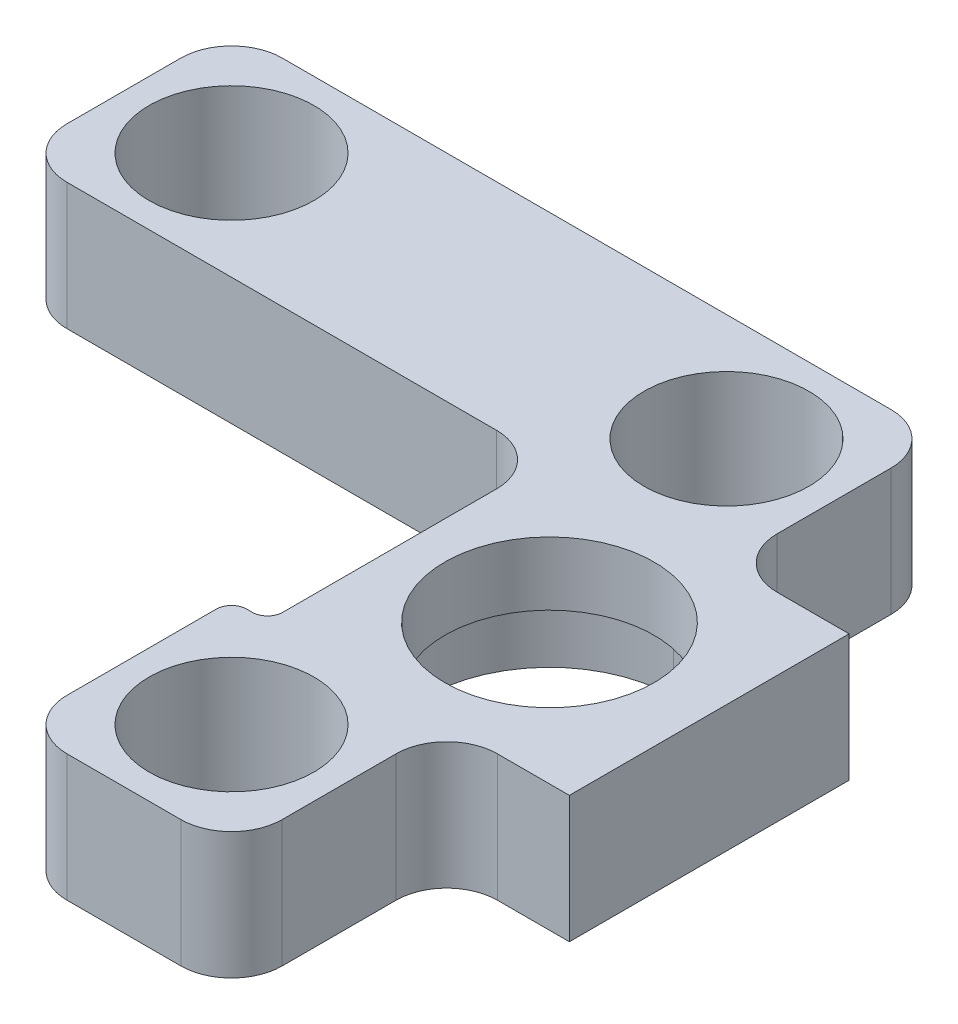
ISO-10303-21;
HEADER;
FILE_DESCRIPTION(('STEP AP214'),'2;1');
FILE_NAME('part.step','',(''),(''),'','','');
FILE_SCHEMA(('AUTOMOTIVE_DESIGN { 1 0 10303 214 1 1 1 1 }'));
ENDSEC;
DATA;
#1=APPLICATION_CONTEXT('core data for automotive mechanical design processes');
#2=APPLICATION_PROTOCOL_DEFINITION('international standard','automotive_design',2000,#1);
#3=PRODUCT_CONTEXT('',#1,'mechanical');
#4=PRODUCT('Part','Part','',(#3));
#5=PRODUCT_RELATED_PRODUCT_CATEGORY('part','',(#4));
#6=PRODUCT_DEFINITION_FORMATION('','',#4);
#7=PRODUCT_DEFINITION_CONTEXT('part definition',#1,'design');
#8=PRODUCT_DEFINITION('design','',#6,#7);
#9=PRODUCT_DEFINITION_SHAPE('','',#8);
#10=(LENGTH_UNIT() NAMED_UNIT(*) SI_UNIT(.MILLI.,.METRE.));
#11=(NAMED_UNIT(*) PLANE_ANGLE_UNIT() SI_UNIT($,.RADIAN.));
#12=(NAMED_UNIT(*) SI_UNIT($,.STERADIAN.) SOLID_ANGLE_UNIT());
#13=UNCERTAINTY_MEASURE_WITH_UNIT(LENGTH_MEASURE(1.E-05),#10,'distance_accuracy_value','');
#14=(GEOMETRIC_REPRESENTATION_CONTEXT(3) GLOBAL_UNCERTAINTY_ASSIGNED_CONTEXT((#13)) GLOBAL_UNIT_ASSIGNED_CONTEXT((#10,
#11,#12)) REPRESENTATION_CONTEXT('',''));
#15=CARTESIAN_POINT('',(0.,0.,0.));
#16=DIRECTION('',(0.,0.,1.));
#17=DIRECTION('',(1.,0.,0.));
#18=AXIS2_PLACEMENT_3D('',#15,#16,#17);
#19=CARTESIAN_POINT('',(-17.35,58.4903845939065,-12.8));
#20=DIRECTION('',(0.,0.,-1.));
#21=DIRECTION('',(0.,1.,0.));
#22=AXIS2_PLACEMENT_3D('',#19,#20,#21);
#23=PLANE('',#22);
#24=DIRECTION('',(-1.,0.,0.));
#25=VECTOR('',#24,1.);
#26=CARTESIAN_POINT('',(-17.35,58.4903845939065,-12.8));
#27=LINE('',#26,#25);
#28=CARTESIAN_POINT('',(8.65000000000003,58.4903845939065,-12.8));
#29=VERTEX_POINT('',#28);
#30=CARTESIAN_POINT('',(-15.35,58.4903845939065,-12.8));
#31=VERTEX_POINT('',#30);
#32=EDGE_CURVE('E288',#29,#31,#27,.T.);
#33=ORIENTED_EDGE('',*,*,#32,.T.);
#34=DIRECTION('',(0.,1.,0.));
#35=VECTOR('',#34,1.);
#36=CARTESIAN_POINT('',(-15.35,58.4903845939065,-12.8));
#37=LINE('',#36,#35);
#38=CARTESIAN_POINT('',(-15.35,63.4903845939065,-12.8));
#39=VERTEX_POINT('',#38);
#40=EDGE_CURVE('E361',#31,#39,#37,.T.);
#41=ORIENTED_EDGE('',*,*,#40,.T.);
#42=DIRECTION('',(1.,0.,0.));
#43=VECTOR('',#42,1.);
#44=CARTESIAN_POINT('',(0.,63.4903845939065,-12.8));
#45=LINE('',#44,#43);
#46=CARTESIAN_POINT('',(8.65000000000003,63.4903845939065,-12.8));
#47=VERTEX_POINT('',#46);
#48=EDGE_CURVE('E242',#39,#47,#45,.T.);
#49=ORIENTED_EDGE('',*,*,#48,.T.);
#50=DIRECTION('',(0.,1.,0.));
#51=VECTOR('',#50,1.);
#52=CARTESIAN_POINT('',(8.65000000000003,58.4903845939065,-12.8));
#53=LINE('',#52,#51);
#54=EDGE_CURVE('E359',#47,#29,#53,.F.);
#55=ORIENTED_EDGE('',*,*,#54,.T.);
#56=EDGE_LOOP('',(#33,#41,#49,#55));
#57=FACE_BOUND('',#56,.T.);
#58=ADVANCED_FACE('F35',(#57),#23,.T.);
#59=CARTESIAN_POINT('',(10.65,58.4903845939065,-12.8));
#60=DIRECTION('',(1.,0.,0.));
#61=DIRECTION('',(0.,0.,-1.));
#62=AXIS2_PLACEMENT_3D('',#59,#60,#61);
#63=PLANE('',#62);
#64=DIRECTION('',(0.,0.,-1.));
#65=VECTOR('',#64,1.);
#66=CARTESIAN_POINT('',(10.65,58.4903845939065,-12.8));
#67=LINE('',#66,#65);
#68=CARTESIAN_POINT('',(10.65,58.4903845939065,-6.3147186257614));
#69=VERTEX_POINT('',#68);
#70=CARTESIAN_POINT('',(10.65,58.4903845939065,-10.8));
#71=VERTEX_POINT('',#70);
#72=EDGE_CURVE('E221',#69,#71,#67,.T.);
#73=ORIENTED_EDGE('',*,*,#72,.T.);
#74=DIRECTION('',(0.,1.,0.));
#75=VECTOR('',#74,1.);
#76=CARTESIAN_POINT('',(10.65,58.4903845939065,-10.8));
#77=LINE('',#76,#75);
#78=CARTESIAN_POINT('',(10.65,63.4903845939065,-10.8));
#79=VERTEX_POINT('',#78);
#80=EDGE_CURVE('E390',#71,#79,#77,.T.);
#81=ORIENTED_EDGE('',*,*,#80,.T.);
#82=DIRECTION('',(0.,0.,1.));
#83=VECTOR('',#82,1.);
#84=CARTESIAN_POINT('',(10.65,63.4903845939065,0.));
#85=LINE('',#84,#83);
#86=CARTESIAN_POINT('',(10.65,63.4903845939065,-6.3147186257614));
#87=VERTEX_POINT('',#86);
#88=EDGE_CURVE('E236',#79,#87,#85,.T.);
#89=ORIENTED_EDGE('',*,*,#88,.T.);
#90=DIRECTION('',(0.,1.,0.));
#91=VECTOR('',#90,1.);
#92=CARTESIAN_POINT('',(10.65,58.4903845939065,-6.3147186257614));
#93=LINE('',#92,#91);
#94=EDGE_CURVE('E388',#87,#69,#93,.F.);
#95=ORIENTED_EDGE('',*,*,#94,.T.);
#96=EDGE_LOOP('',(#73,#81,#89,#95));
#97=FACE_BOUND('',#96,.T.);
#98=ADVANCED_FACE('F430',(#97),#63,.T.);
#99=CARTESIAN_POINT('',(10.65,58.4903845939065,-4.3147186257614));
#100=DIRECTION('',(0.,0.,-1.));
#101=DIRECTION('',(0.,1.,0.));
#102=AXIS2_PLACEMENT_3D('',#99,#100,#101);
#103=PLANE('',#102);
#104=DIRECTION('',(-1.,0.,0.));
#105=VECTOR('',#104,1.);
#106=CARTESIAN_POINT('',(10.65,58.4903845939065,-4.3147186257614));
#107=LINE('',#106,#105);
#108=CARTESIAN_POINT('',(15.48528137,58.4903845939065,-4.3147186257614));
#109=VERTEX_POINT('',#108);
#110=CARTESIAN_POINT('',(12.65,58.4903845939065,-4.3147186257614));
#111=VERTEX_POINT('',#110);
#112=EDGE_CURVE('E321',#109,#111,#107,.T.);
#113=ORIENTED_EDGE('',*,*,#112,.T.);
#114=DIRECTION('',(0.,1.,0.));
#115=VECTOR('',#114,1.);
#116=CARTESIAN_POINT('',(12.65,63.4903845939065,-4.3147186257614));
#117=LINE('',#116,#115);
#118=CARTESIAN_POINT('',(12.65,63.4903845939065,-4.3147186257614));
#119=VERTEX_POINT('',#118);
#120=EDGE_CURVE('E393',#111,#119,#117,.T.);
#121=ORIENTED_EDGE('',*,*,#120,.T.);
#122=DIRECTION('',(1.,0.,0.));
#123=VECTOR('',#122,1.);
#124=CARTESIAN_POINT('',(0.,63.4903845939065,-4.3147186257614));
#125=LINE('',#124,#123);
#126=CARTESIAN_POINT('',(15.48528137,63.4903845939065,-4.3147186257614));
#127=VERTEX_POINT('',#126);
#128=EDGE_CURVE('E234',#119,#127,#125,.T.);
#129=ORIENTED_EDGE('',*,*,#128,.T.);
#130=DIRECTION('',(0.,1.,0.));
#131=VECTOR('',#130,1.);
#132=CARTESIAN_POINT('',(15.48528137,58.4903845939065,-4.3147186257614));
#133=LINE('',#132,#131);
#134=EDGE_CURVE('E220',#109,#127,#133,.T.);
#135=ORIENTED_EDGE('',*,*,#134,.F.);
#136=EDGE_LOOP('',(#113,#121,#129,#135));
#137=FACE_BOUND('',#136,.T.);
#138=ADVANCED_FACE('F426',(#137),#103,.T.);
#139=CARTESIAN_POINT('',(15.48528137,58.4903845939065,-4.3147186257614));
#140=DIRECTION('',(1.,0.,0.));
#141=DIRECTION('',(0.,1.,0.));
#142=AXIS2_PLACEMENT_3D('',#139,#140,#141);
#143=PLANE('',#142);
#144=ORIENTED_EDGE('',*,*,#134,.T.);
#145=DIRECTION('',(0.,0.,1.));
#146=VECTOR('',#145,1.);
#147=CARTESIAN_POINT('',(15.48528137,63.4903845939065,0.));
#148=LINE('',#147,#146);
#149=CARTESIAN_POINT('',(15.48528137,63.4903845939065,6.71471862576139));
#150=VERTEX_POINT('',#149);
#151=EDGE_CURVE('E228',#127,#150,#148,.T.);
#152=ORIENTED_EDGE('',*,*,#151,.T.);
#153=DIRECTION('',(0.,1.,0.));
#154=VECTOR('',#153,1.);
#155=CARTESIAN_POINT('',(15.48528137,58.4903845939065,6.71471862576139));
#156=LINE('',#155,#154);
#157=CARTESIAN_POINT('',(15.48528137,58.4903845939065,6.71471862576139));
#158=VERTEX_POINT('',#157);
#159=EDGE_CURVE('E209',#158,#150,#156,.T.);
#160=ORIENTED_EDGE('',*,*,#159,.F.);
#161=DIRECTION('',(0.,0.,-1.));
#162=VECTOR('',#161,1.);
#163=CARTESIAN_POINT('',(15.48528137,58.4903845939065,-4.3147186257614));
#164=LINE('',#163,#162);
#165=EDGE_CURVE('E319',#158,#109,#164,.T.);
#166=ORIENTED_EDGE('',*,*,#165,.T.);
#167=EDGE_LOOP('',(#144,#152,#160,#166));
#168=FACE_BOUND('',#167,.T.);
#169=ADVANCED_FACE('F233',(#168),#143,.T.);
#170=CARTESIAN_POINT('',(15.48528137,58.4903845939065,6.71471862576139));
#171=DIRECTION('',(0.,0.,1.));
#172=DIRECTION('',(1.,0.,0.));
#173=AXIS2_PLACEMENT_3D('',#170,#171,#172);
#174=PLANE('',#173);
#175=DIRECTION('',(-1.,0.,0.));
#176=VECTOR('',#175,1.);
#177=CARTESIAN_POINT('',(0.,63.4903845939065,6.7147186257614));
#178=LINE('',#177,#176);
#179=CARTESIAN_POINT('',(12.65,63.4903845939065,6.71471862576139));
#180=VERTEX_POINT('',#179);
#181=EDGE_CURVE('E212',#150,#180,#178,.T.);
#182=ORIENTED_EDGE('',*,*,#181,.T.);
#183=DIRECTION('',(0.,1.,0.));
#184=VECTOR('',#183,1.);
#185=CARTESIAN_POINT('',(12.65,58.4903845939065,6.71471862576139));
#186=LINE('',#185,#184);
#187=CARTESIAN_POINT('',(12.65,58.4903845939065,6.71471862576139));
#188=VERTEX_POINT('',#187);
#189=EDGE_CURVE('E401',#180,#188,#186,.F.);
#190=ORIENTED_EDGE('',*,*,#189,.T.);
#191=DIRECTION('',(1.,0.,0.));
#192=VECTOR('',#191,1.);
#193=CARTESIAN_POINT('',(15.48528137,58.4903845939065,6.71471862576139));
#194=LINE('',#193,#192);
#195=EDGE_CURVE('E215',#188,#158,#194,.T.);
#196=ORIENTED_EDGE('',*,*,#195,.T.);
#197=ORIENTED_EDGE('',*,*,#159,.T.);
#198=EDGE_LOOP('',(#182,#190,#196,#197));
#199=FACE_BOUND('',#198,.T.);
#200=ADVANCED_FACE('F211',(#199),#174,.T.);
#201=CARTESIAN_POINT('',(10.65,58.4903845939065,6.71471862576139));
#202=DIRECTION('',(1.,0.,0.));
#203=DIRECTION('',(0.,0.,-1.));
#204=AXIS2_PLACEMENT_3D('',#201,#202,#203);
#205=PLANE('',#204);
#206=DIRECTION('',(0.,0.,-1.));
#207=VECTOR('',#206,1.);
#208=CARTESIAN_POINT('',(10.65,58.4903845939065,6.71471862576139));
#209=LINE('',#208,#207);
#210=CARTESIAN_POINT('',(10.65,58.4903845939065,13.2));
#211=VERTEX_POINT('',#210);
#212=CARTESIAN_POINT('',(10.65,58.4903845939065,8.71471862576139));
#213=VERTEX_POINT('',#212);
#214=EDGE_CURVE('E315',#211,#213,#209,.T.);
#215=ORIENTED_EDGE('',*,*,#214,.T.);
#216=DIRECTION('',(0.,1.,0.));
#217=VECTOR('',#216,1.);
#218=CARTESIAN_POINT('',(10.65,63.4903845939065,8.71471862576139));
#219=LINE('',#218,#217);
#220=CARTESIAN_POINT('',(10.65,63.4903845939065,8.71471862576139));
#221=VERTEX_POINT('',#220);
#222=EDGE_CURVE('E398',#213,#221,#219,.T.);
#223=ORIENTED_EDGE('',*,*,#222,.T.);
#224=DIRECTION('',(0.,0.,1.));
#225=VECTOR('',#224,1.);
#226=CARTESIAN_POINT('',(10.65,63.4903845939065,0.));
#227=LINE('',#226,#225);
#228=CARTESIAN_POINT('',(10.65,63.4903845939065,13.2));
#229=VERTEX_POINT('',#228);
#230=EDGE_CURVE('E230',#221,#229,#227,.T.);
#231=ORIENTED_EDGE('',*,*,#230,.T.);
#232=DIRECTION('',(0.,1.,0.));
#233=VECTOR('',#232,1.);
#234=CARTESIAN_POINT('',(10.65,58.4903845939065,13.2));
#235=LINE('',#234,#233);
#236=EDGE_CURVE('E396',#229,#211,#235,.F.);
#237=ORIENTED_EDGE('',*,*,#236,.T.);
#238=EDGE_LOOP('',(#215,#223,#231,#237));
#239=FACE_BOUND('',#238,.T.);
#240=ADVANCED_FACE('F483',(#239),#205,.T.);
#241=CARTESIAN_POINT('',(10.65,58.4903845939065,15.2));
#242=DIRECTION('',(0.,0.,1.));
#243=DIRECTION('',(0.,-1.,0.));
#244=AXIS2_PLACEMENT_3D('',#241,#242,#243);
#245=PLANE('',#244);
#246=DIRECTION('',(1.,0.,0.));
#247=VECTOR('',#246,1.);
#248=CARTESIAN_POINT('',(10.65,58.4903845939065,15.2));
#249=LINE('',#248,#247);
#250=CARTESIAN_POINT('',(4.16471862576142,58.4903845939065,15.2));
#251=VERTEX_POINT('',#250);
#252=CARTESIAN_POINT('',(8.65000000000003,58.4903845939065,15.2));
#253=VERTEX_POINT('',#252);
#254=EDGE_CURVE('E313',#251,#253,#249,.T.);
#255=ORIENTED_EDGE('',*,*,#254,.T.);
#256=DIRECTION('',(0.,1.,0.));
#257=VECTOR('',#256,1.);
#258=CARTESIAN_POINT('',(8.65000000000003,58.4903845939065,15.2));
#259=LINE('',#258,#257);
#260=CARTESIAN_POINT('',(8.65000000000003,63.4903845939065,15.2));
#261=VERTEX_POINT('',#260);
#262=EDGE_CURVE('E404',#253,#261,#259,.T.);
#263=ORIENTED_EDGE('',*,*,#262,.T.);
#264=DIRECTION('',(-1.,0.,0.));
#265=VECTOR('',#264,1.);
#266=CARTESIAN_POINT('',(0.,63.4903845939065,15.2));
#267=LINE('',#266,#265);
#268=CARTESIAN_POINT('',(4.16471862576142,63.4903845939065,15.2));
#269=VERTEX_POINT('',#268);
#270=EDGE_CURVE('E479',#261,#269,#267,.T.);
#271=ORIENTED_EDGE('',*,*,#270,.T.);
#272=DIRECTION('',(0.,1.,0.));
#273=VECTOR('',#272,1.);
#274=CARTESIAN_POINT('',(4.16471862576142,58.4903845939065,15.2));
#275=LINE('',#274,#273);
#276=EDGE_CURVE('E57',#269,#251,#275,.F.);
#277=ORIENTED_EDGE('',*,*,#276,.T.);
#278=EDGE_LOOP('',(#255,#263,#271,#277));
#279=FACE_BOUND('',#278,.T.);
#280=ADVANCED_FACE('F489',(#279),#245,.T.);
#281=CARTESIAN_POINT('',(2.16471862576142,58.4903845939065,15.2));
#282=DIRECTION('',(-1.,0.,0.));
#283=DIRECTION('',(0.,0.,1.));
#284=AXIS2_PLACEMENT_3D('',#281,#282,#283);
#285=PLANE('',#284);
#286=DIRECTION('',(0.,0.,1.));
#287=VECTOR('',#286,1.);
#288=CARTESIAN_POINT('',(2.16471862576142,58.4903845939065,15.2));
#289=LINE('',#288,#287);
#290=CARTESIAN_POINT('',(2.16471862576142,58.4903845939065,7.31471862576143));
#291=VERTEX_POINT('',#290);
#292=CARTESIAN_POINT('',(2.16471862576142,58.4903845939065,13.2));
#293=VERTEX_POINT('',#292);
#294=EDGE_CURVE('E310',#291,#293,#289,.T.);
#295=ORIENTED_EDGE('',*,*,#294,.T.);
#296=DIRECTION('',(0.,1.,0.));
#297=VECTOR('',#296,1.);
#298=CARTESIAN_POINT('',(2.16471862576142,58.4903845939065,13.2));
#299=LINE('',#298,#297);
#300=CARTESIAN_POINT('',(2.16471862576142,63.4903845939065,13.2));
#301=VERTEX_POINT('',#300);
#302=EDGE_CURVE('E407',#293,#301,#299,.T.);
#303=ORIENTED_EDGE('',*,*,#302,.T.);
#304=DIRECTION('',(0.,0.,-1.));
#305=VECTOR('',#304,1.);
#306=CARTESIAN_POINT('',(2.16471862576142,63.4903845939065,0.));
#307=LINE('',#306,#305);
#308=CARTESIAN_POINT('',(2.16471862576142,63.4903845939065,7.31471862576143));
#309=VERTEX_POINT('',#308);
#310=EDGE_CURVE('E471',#301,#309,#307,.T.);
#311=ORIENTED_EDGE('',*,*,#310,.T.);
#312=DIRECTION('',(0.,1.,0.));
#313=VECTOR('',#312,1.);
#314=CARTESIAN_POINT('',(2.16471862576142,58.4903845939065,7.31471862576143));
#315=LINE('',#314,#313);
#316=EDGE_CURVE('E340',#309,#291,#315,.F.);
#317=ORIENTED_EDGE('',*,*,#316,.T.);
#318=EDGE_LOOP('',(#295,#303,#311,#317));
#319=FACE_BOUND('',#318,.T.);
#320=ADVANCED_FACE('F495',(#319),#285,.T.);
#321=CARTESIAN_POINT('',(2.16471862576142,58.4903845939065,6.71471862576143));
#322=DIRECTION('',(0.,0.,-1.));
#323=DIRECTION('',(0.,1.,0.));
#324=AXIS2_PLACEMENT_3D('',#321,#322,#323);
#325=PLANE('',#324);
#326=DIRECTION('',(-1.,0.,0.));
#327=VECTOR('',#326,1.);
#328=CARTESIAN_POINT('',(2.16471862576142,58.4903845939065,6.71471862576143));
#329=LINE('',#328,#327);
#330=CARTESIAN_POINT('',(2.98528137,58.4903845939065,6.71471862576143));
#331=VERTEX_POINT('',#330);
#332=CARTESIAN_POINT('',(2.76471862576142,58.4903845939065,6.71471862576143));
#333=VERTEX_POINT('',#332);
#334=EDGE_CURVE('E307',#331,#333,#329,.T.);
#335=ORIENTED_EDGE('',*,*,#334,.T.);
#336=DIRECTION('',(0.,1.,0.));
#337=VECTOR('',#336,1.);
#338=CARTESIAN_POINT('',(2.76471862576142,58.4903845939065,6.71471862576143));
#339=LINE('',#338,#337);
#340=CARTESIAN_POINT('',(2.76471862576142,63.4903845939065,6.71471862576143));
#341=VERTEX_POINT('',#340);
#342=EDGE_CURVE('E334',#333,#341,#339,.T.);
#343=ORIENTED_EDGE('',*,*,#342,.T.);
#344=DIRECTION('',(1.,0.,0.));
#345=VECTOR('',#344,1.);
#346=CARTESIAN_POINT('',(0.,63.4903845939065,6.71471862576143));
#347=LINE('',#346,#345);
#348=CARTESIAN_POINT('',(2.98528137,63.4903845939065,6.71471862576143));
#349=VERTEX_POINT('',#348);
#350=EDGE_CURVE('E467',#341,#349,#347,.T.);
#351=ORIENTED_EDGE('',*,*,#350,.T.);
#352=DIRECTION('',(0.,1.,0.));
#353=VECTOR('',#352,1.);
#354=CARTESIAN_POINT('',(2.98528137,58.4903845939065,6.71471862576143));
#355=LINE('',#354,#353);
#356=EDGE_CURVE('E326',#349,#331,#355,.F.);
#357=ORIENTED_EDGE('',*,*,#356,.T.);
#358=EDGE_LOOP('',(#335,#343,#351,#357));
#359=FACE_BOUND('',#358,.T.);
#360=ADVANCED_FACE('F505',(#359),#325,.T.);
#361=CARTESIAN_POINT('',(3.58528137,58.4903845939065,6.71471862576143));
#362=DIRECTION('',(-1.,0.,0.));
#363=DIRECTION('',(0.,-1.,0.));
#364=AXIS2_PLACEMENT_3D('',#361,#362,#363);
#365=PLANE('',#364);
#366=DIRECTION('',(0.,0.,-1.));
#367=VECTOR('',#366,1.);
#368=CARTESIAN_POINT('',(3.58528137,63.4903845939065,0.));
#369=LINE('',#368,#367);
#370=CARTESIAN_POINT('',(3.58528137,63.4903845939065,6.11471862576143));
#371=VERTEX_POINT('',#370);
#372=CARTESIAN_POINT('',(3.58528137,63.4903845939065,-2.31471862576144));
#373=VERTEX_POINT('',#372);
#374=EDGE_CURVE('E462',#371,#373,#369,.T.);
#375=ORIENTED_EDGE('',*,*,#374,.T.);
#376=DIRECTION('',(0.,1.,0.));
#377=VECTOR('',#376,1.);
#378=CARTESIAN_POINT('',(3.58528137,58.4903845939065,-2.31471862576144));
#379=LINE('',#378,#377);
#380=CARTESIAN_POINT('',(3.58528137,58.4903845939065,-2.31471862576144));
#381=VERTEX_POINT('',#380);
#382=EDGE_CURVE('E357',#373,#381,#379,.F.);
#383=ORIENTED_EDGE('',*,*,#382,.T.);
#384=DIRECTION('',(0.,0.,1.));
#385=VECTOR('',#384,1.);
#386=CARTESIAN_POINT('',(3.58528137,58.4903845939065,6.71471862576143));
#387=LINE('',#386,#385);
#388=CARTESIAN_POINT('',(3.58528137,58.4903845939065,6.11471862576143));
#389=VERTEX_POINT('',#388);
#390=EDGE_CURVE('E305',#381,#389,#387,.T.);
#391=ORIENTED_EDGE('',*,*,#390,.T.);
#392=DIRECTION('',(0.,1.,0.));
#393=VECTOR('',#392,1.);
#394=CARTESIAN_POINT('',(3.58528137,63.4903845939065,6.11471862576143));
#395=LINE('',#394,#393);
#396=EDGE_CURVE('E344',#389,#371,#395,.T.);
#397=ORIENTED_EDGE('',*,*,#396,.T.);
#398=EDGE_LOOP('',(#375,#383,#391,#397));
#399=FACE_BOUND('',#398,.T.);
#400=ADVANCED_FACE('F464',(#399),#365,.T.);
#401=CARTESIAN_POINT('',(3.58528137,58.4903845939065,-4.31471862576144));
#402=DIRECTION('',(0.,0.,1.));
#403=DIRECTION('',(1.,0.,0.));
#404=AXIS2_PLACEMENT_3D('',#401,#402,#403);
#405=PLANE('',#404);
#406=DIRECTION('',(1.,0.,0.));
#407=VECTOR('',#406,1.);
#408=CARTESIAN_POINT('',(3.58528137,58.4903845939065,-4.31471862576144));
#409=LINE('',#408,#407);
#410=CARTESIAN_POINT('',(-15.35,58.4903845939065,-4.3147186257614));
#411=VERTEX_POINT('',#410);
#412=CARTESIAN_POINT('',(1.58528137,58.4903845939065,-4.31471862576144));
#413=VERTEX_POINT('',#412);
#414=EDGE_CURVE('E302',#411,#413,#409,.T.);
#415=ORIENTED_EDGE('',*,*,#414,.T.);
#416=DIRECTION('',(0.,1.,0.));
#417=VECTOR('',#416,1.);
#418=CARTESIAN_POINT('',(1.58528137,63.4903845939065,-4.31471862576144));
#419=LINE('',#418,#417);
#420=CARTESIAN_POINT('',(1.58528137,63.4903845939065,-4.31471862576144));
#421=VERTEX_POINT('',#420);
#422=EDGE_CURVE('E354',#413,#421,#419,.T.);
#423=ORIENTED_EDGE('',*,*,#422,.T.);
#424=DIRECTION('',(-1.,0.,0.));
#425=VECTOR('',#424,1.);
#426=CARTESIAN_POINT('',(0.,63.4903845939065,-4.31471862576144));
#427=LINE('',#426,#425);
#428=CARTESIAN_POINT('',(-15.35,63.4903845939065,-4.3147186257614));
#429=VERTEX_POINT('',#428);
#430=EDGE_CURVE('E248',#421,#429,#427,.T.);
#431=ORIENTED_EDGE('',*,*,#430,.T.);
#432=DIRECTION('',(0.,1.,0.));
#433=VECTOR('',#432,1.);
#434=CARTESIAN_POINT('',(-15.35,58.4903845939065,-4.3147186257614));
#435=LINE('',#434,#433);
#436=EDGE_CURVE('E352',#429,#411,#435,.F.);
#437=ORIENTED_EDGE('',*,*,#436,.T.);
#438=EDGE_LOOP('',(#415,#423,#431,#437));
#439=FACE_BOUND('',#438,.T.);
#440=ADVANCED_FACE('F453',(#439),#405,.T.);
#441=CARTESIAN_POINT('',(-17.35,58.4903845939065,-4.3147186257614));
#442=DIRECTION('',(-1.,0.,0.));
#443=DIRECTION('',(0.,0.,1.));
#444=AXIS2_PLACEMENT_3D('',#441,#442,#443);
#445=PLANE('',#444);
#446=DIRECTION('',(0.,0.,-1.));
#447=VECTOR('',#446,1.);
#448=CARTESIAN_POINT('',(-17.35,63.4903845939065,0.));
#449=LINE('',#448,#447);
#450=CARTESIAN_POINT('',(-17.35,63.4903845939065,-6.3147186257614));
#451=VERTEX_POINT('',#450);
#452=CARTESIAN_POINT('',(-17.35,63.4903845939065,-10.8));
#453=VERTEX_POINT('',#452);
#454=EDGE_CURVE('E245',#451,#453,#449,.T.);
#455=ORIENTED_EDGE('',*,*,#454,.T.);
#456=DIRECTION('',(0.,1.,0.));
#457=VECTOR('',#456,1.);
#458=CARTESIAN_POINT('',(-17.35,58.4903845939065,-10.8));
#459=LINE('',#458,#457);
#460=CARTESIAN_POINT('',(-17.35,58.4903845939065,-10.8));
#461=VERTEX_POINT('',#460);
#462=EDGE_CURVE('E377',#453,#461,#459,.F.);
#463=ORIENTED_EDGE('',*,*,#462,.T.);
#464=DIRECTION('',(0.,0.,1.));
#465=VECTOR('',#464,1.);
#466=CARTESIAN_POINT('',(-17.35,58.4903845939065,-4.3147186257614));
#467=LINE('',#466,#465);
#468=CARTESIAN_POINT('',(-17.35,58.4903845939065,-6.3147186257614));
#469=VERTEX_POINT('',#468);
#470=EDGE_CURVE('E299',#461,#469,#467,.T.);
#471=ORIENTED_EDGE('',*,*,#470,.T.);
#472=DIRECTION('',(0.,1.,0.));
#473=VECTOR('',#472,1.);
#474=CARTESIAN_POINT('',(-17.35,58.4903845939065,-6.3147186257614));
#475=LINE('',#474,#473);
#476=EDGE_CURVE('E374',#469,#451,#475,.T.);
#477=ORIENTED_EDGE('',*,*,#476,.T.);
#478=EDGE_LOOP('',(#455,#463,#471,#477));
#479=FACE_BOUND('',#478,.T.);
#480=ADVANCED_FACE('F445',(#479),#445,.T.);
#481=CARTESIAN_POINT('',(0.,58.4903845939065,0.));
#482=DIRECTION('',(0.,-1.,0.));
#483=DIRECTION('',(0.,0.,-1.));
#484=AXIS2_PLACEMENT_3D('',#481,#482,#483);
#485=PLANE('',#484);
#486=CARTESIAN_POINT('',(6.40735931288072,58.4903845939065,10.9573593128807));
#487=DIRECTION('',(0.,1.,0.));
#488=DIRECTION('',(0.,0.,1.));
#489=AXIS2_PLACEMENT_3D('',#486,#487,#488);
#490=CIRCLE('',#489,3.25);
#491=CARTESIAN_POINT('',(6.40735931288072,58.4903845939065,14.2073593128807));
#492=VERTEX_POINT('',#491);
#493=EDGE_CURVE('E251',#492,#492,#490,.T.);
#494=ORIENTED_EDGE('',*,*,#493,.T.);
#495=EDGE_LOOP('',(#494));
#496=FACE_BOUND('',#495,.T.);
#497=CARTESIAN_POINT('',(6.40735931288076,58.4903845939065,-8.55735931288068));
#498=DIRECTION('',(0.,1.,0.));
#499=DIRECTION('',(0.,0.,1.));
#500=AXIS2_PLACEMENT_3D('',#497,#498,#499);
#501=CIRCLE('',#500,3.24999999999997);
#502=CARTESIAN_POINT('',(6.40735931288076,58.4903845939065,-5.30735931288071));
#503=VERTEX_POINT('',#502);
#504=EDGE_CURVE('E254',#503,#503,#501,.T.);
#505=ORIENTED_EDGE('',*,*,#504,.T.);
#506=EDGE_LOOP('',(#505));
#507=FACE_BOUND('',#506,.T.);
#508=CARTESIAN_POINT('',(-13.1073593128807,58.4903845939065,-8.55735931288072));
#509=DIRECTION('',(0.,1.,0.));
#510=DIRECTION('',(0.,0.,1.));
#511=AXIS2_PLACEMENT_3D('',#508,#509,#510);
#512=CIRCLE('',#511,3.25);
#513=CARTESIAN_POINT('',(-13.1073593128807,58.4903845939065,-5.30735931288072));
#514=VERTEX_POINT('',#513);
#515=EDGE_CURVE('E257',#514,#514,#512,.T.);
#516=ORIENTED_EDGE('',*,*,#515,.T.);
#517=EDGE_LOOP('',(#516));
#518=FACE_BOUND('',#517,.T.);
#519=CARTESIAN_POINT('',(9.18528137,58.4903845939065,1.2));
#520=DIRECTION('',(0.,1.,0.));
#521=DIRECTION('',(0.,0.,1.));
#522=AXIS2_PLACEMENT_3D('',#519,#520,#521);
#523=CIRCLE('',#522,4.89999999999986);
#524=CARTESIAN_POINT('',(9.18528137,58.4903845939065,-3.69999999999989));
#525=VERTEX_POINT('',#524);
#526=CARTESIAN_POINT('',(9.18528137,58.4903845939065,6.09999999999984));
#527=VERTEX_POINT('',#526);
#528=EDGE_CURVE('E261',#525,#527,#523,.T.);
#529=ORIENTED_EDGE('',*,*,#528,.T.);
#530=DIRECTION('',(1.,0.,0.));
#531=VECTOR('',#530,1.);
#532=CARTESIAN_POINT('',(14.78528137,58.4903845939065,6.1));
#533=LINE('',#532,#531);
#534=CARTESIAN_POINT('',(14.78528137,58.4903845939065,6.1));
#535=VERTEX_POINT('',#534);
#536=EDGE_CURVE('E264',#527,#535,#533,.T.);
#537=ORIENTED_EDGE('',*,*,#536,.T.);
#538=DIRECTION('',(0.,0.,-1.));
#539=VECTOR('',#538,1.);
#540=CARTESIAN_POINT('',(14.78528137,58.4903845939065,-3.70000000000001));
#541=LINE('',#540,#539);
#542=CARTESIAN_POINT('',(14.78528137,58.4903845939065,-3.70000000000001));
#543=VERTEX_POINT('',#542);
#544=EDGE_CURVE('E268',#535,#543,#541,.T.);
#545=ORIENTED_EDGE('',*,*,#544,.T.);
#546=DIRECTION('',(-1.,0.,0.));
#547=VECTOR('',#546,1.);
#548=CARTESIAN_POINT('',(14.78528137,58.4903845939065,-3.70000000000001));
#549=LINE('',#548,#547);
#550=EDGE_CURVE('E271',#543,#525,#549,.T.);
#551=ORIENTED_EDGE('',*,*,#550,.T.);
#552=EDGE_LOOP('',(#529,#537,#545,#551));
#553=FACE_BOUND('',#552,.T.);
#554=ORIENTED_EDGE('',*,*,#470,.F.);
#555=CARTESIAN_POINT('',(-15.35,58.4903845939065,-10.8));
#556=DIRECTION('',(0.,-1.,0.));
#557=DIRECTION('',(0.,0.,-1.));
#558=AXIS2_PLACEMENT_3D('',#555,#556,#557);
#559=CIRCLE('',#558,2.);
#560=EDGE_CURVE('E386',#461,#31,#559,.T.);
#561=ORIENTED_EDGE('',*,*,#560,.T.);
#562=ORIENTED_EDGE('',*,*,#32,.F.);
#563=CARTESIAN_POINT('',(8.65000000000003,58.4903845939065,-10.8));
#564=DIRECTION('',(0.,-1.,0.));
#565=DIRECTION('',(0.,0.,-1.));
#566=AXIS2_PLACEMENT_3D('',#563,#564,#565);
#567=CIRCLE('',#566,2.);
#568=EDGE_CURVE('E382',#29,#71,#567,.T.);
#569=ORIENTED_EDGE('',*,*,#568,.T.);
#570=ORIENTED_EDGE('',*,*,#72,.F.);
#571=CARTESIAN_POINT('',(12.65,58.4903845939065,-6.3147186257614));
#572=DIRECTION('',(0.,-1.,0.));
#573=DIRECTION('',(0.,0.,-1.));
#574=AXIS2_PLACEMENT_3D('',#571,#572,#573);
#575=CIRCLE('',#574,2.);
#576=EDGE_CURVE('E416',#69,#111,#575,.F.);
#577=ORIENTED_EDGE('',*,*,#576,.T.);
#578=ORIENTED_EDGE('',*,*,#112,.F.);
#579=ORIENTED_EDGE('',*,*,#165,.F.);
#580=ORIENTED_EDGE('',*,*,#195,.F.);
#581=CARTESIAN_POINT('',(12.65,58.4903845939065,8.71471862576139));
#582=DIRECTION('',(0.,-1.,0.));
#583=DIRECTION('',(0.,0.,-1.));
#584=AXIS2_PLACEMENT_3D('',#581,#582,#583);
#585=CIRCLE('',#584,2.);
#586=EDGE_CURVE('E11',#188,#213,#585,.F.);
#587=ORIENTED_EDGE('',*,*,#586,.T.);
#588=ORIENTED_EDGE('',*,*,#214,.F.);
#589=CARTESIAN_POINT('',(8.65000000000003,58.4903845939065,13.2));
#590=DIRECTION('',(0.,-1.,0.));
#591=DIRECTION('',(0.,0.,-1.));
#592=AXIS2_PLACEMENT_3D('',#589,#590,#591);
#593=CIRCLE('',#592,2.);
#594=EDGE_CURVE('E50',#211,#253,#593,.T.);
#595=ORIENTED_EDGE('',*,*,#594,.T.);
#596=ORIENTED_EDGE('',*,*,#254,.F.);
#597=CARTESIAN_POINT('',(4.16471862576142,58.4903845939065,13.2));
#598=DIRECTION('',(0.,-1.,0.));
#599=DIRECTION('',(0.,0.,-1.));
#600=AXIS2_PLACEMENT_3D('',#597,#598,#599);
#601=CIRCLE('',#600,2.);
#602=EDGE_CURVE('E379',#251,#293,#601,.T.);
#603=ORIENTED_EDGE('',*,*,#602,.T.);
#604=ORIENTED_EDGE('',*,*,#294,.F.);
#605=CARTESIAN_POINT('',(2.76471862576142,58.4903845939065,7.31471862576143));
#606=DIRECTION('',(0.,-1.,0.));
#607=DIRECTION('',(0.,0.,-1.));
#608=AXIS2_PLACEMENT_3D('',#605,#606,#607);
#609=CIRCLE('',#608,0.6);
#610=EDGE_CURVE('E342',#291,#333,#609,.T.);
#611=ORIENTED_EDGE('',*,*,#610,.T.);
#612=ORIENTED_EDGE('',*,*,#334,.F.);
#613=CARTESIAN_POINT('',(2.98528137,58.4903845939065,6.11471862576143));
#614=DIRECTION('',(0.,-1.,0.));
#615=DIRECTION('',(0.,0.,-1.));
#616=AXIS2_PLACEMENT_3D('',#613,#614,#615);
#617=CIRCLE('',#616,0.6);
#618=EDGE_CURVE('E349',#331,#389,#617,.F.);
#619=ORIENTED_EDGE('',*,*,#618,.T.);
#620=ORIENTED_EDGE('',*,*,#390,.F.);
#621=CARTESIAN_POINT('',(1.58528137,58.4903845939065,-2.31471862576144));
#622=DIRECTION('',(0.,-1.,0.));
#623=DIRECTION('',(0.,0.,-1.));
#624=AXIS2_PLACEMENT_3D('',#621,#622,#623);
#625=CIRCLE('',#624,2.);
#626=EDGE_CURVE('E412',#381,#413,#625,.F.);
#627=ORIENTED_EDGE('',*,*,#626,.T.);
#628=ORIENTED_EDGE('',*,*,#414,.F.);
#629=CARTESIAN_POINT('',(-15.35,58.4903845939065,-6.3147186257614));
#630=DIRECTION('',(0.,-1.,0.));
#631=DIRECTION('',(0.,0.,-1.));
#632=AXIS2_PLACEMENT_3D('',#629,#630,#631);
#633=CIRCLE('',#632,2.);
#634=EDGE_CURVE('E384',#411,#469,#633,.T.);
#635=ORIENTED_EDGE('',*,*,#634,.T.);
#636=EDGE_LOOP('',(#554,#561,#562,#569,#570,#577,#578,#579,#580,#587,#588,#595,#596,#603,#604,
#611,#612,#619,#620,#627,#628,#635));
#637=FACE_BOUND('',#636,.T.);
#638=ADVANCED_FACE('F421',(#496,#507,#518,#553,#637),#485,.T.);
#639=CARTESIAN_POINT('',(9.18528137,58.4903845939065,1.2));
#640=DIRECTION('',(0.,1.,0.));
#641=DIRECTION('',(0.,0.,1.));
#642=AXIS2_PLACEMENT_3D('',#639,#640,#641);
#643=CYLINDRICAL_SURFACE('',#642,4.89999999999986);
#644=CARTESIAN_POINT('',(9.18528137,60.9903845939065,1.2));
#645=DIRECTION('',(0.,1.,0.));
#646=DIRECTION('',(0.,0.,1.));
#647=AXIS2_PLACEMENT_3D('',#644,#645,#646);
#648=CIRCLE('',#647,4.89999999999986);
#649=CARTESIAN_POINT('',(9.18528137,60.9903845939065,-3.69999999999989));
#650=VERTEX_POINT('',#649);
#651=CARTESIAN_POINT('',(9.18528137,60.9903845939065,6.09999999999984));
#652=VERTEX_POINT('',#651);
#653=EDGE_CURVE('E260',#650,#652,#648,.T.);
#654=ORIENTED_EDGE('',*,*,#653,.T.);
#655=DIRECTION('',(0.,1.,0.));
#656=VECTOR('',#655,1.);
#657=CARTESIAN_POINT('',(9.18528137,58.4903845939065,6.09999999999984));
#658=LINE('',#657,#656);
#659=EDGE_CURVE('E274',#527,#652,#658,.T.);
#660=ORIENTED_EDGE('',*,*,#659,.F.);
#661=ORIENTED_EDGE('',*,*,#528,.F.);
#662=DIRECTION('',(0.,1.,0.));
#663=VECTOR('',#662,1.);
#664=CARTESIAN_POINT('',(9.18528137,58.4903845939065,-3.69999999999989));
#665=LINE('',#664,#663);
#666=EDGE_CURVE('E285',#525,#650,#665,.T.);
#667=ORIENTED_EDGE('',*,*,#666,.T.);
#668=EDGE_LOOP('',(#654,#660,#661,#667));
#669=FACE_BOUND('',#668,.T.);
#670=ADVANCED_FACE('F548',(#669),#643,.F.);
#671=CARTESIAN_POINT('',(14.78528137,58.4903845939065,-3.70000000000001));
#672=DIRECTION('',(0.,0.,-1.));
#673=DIRECTION('',(-1.,0.,0.));
#674=AXIS2_PLACEMENT_3D('',#671,#672,#673);
#675=PLANE('',#674);
#676=DIRECTION('',(-1.,0.,0.));
#677=VECTOR('',#676,1.);
#678=CARTESIAN_POINT('',(14.78528137,60.9903845939065,-3.70000000000001));
#679=LINE('',#678,#677);
#680=CARTESIAN_POINT('',(14.78528137,60.9903845939065,-3.70000000000001));
#681=VERTEX_POINT('',#680);
#682=EDGE_CURVE('E265',#681,#650,#679,.T.);
#683=ORIENTED_EDGE('',*,*,#682,.T.);
#684=ORIENTED_EDGE('',*,*,#666,.F.);
#685=ORIENTED_EDGE('',*,*,#550,.F.);
#686=DIRECTION('',(0.,1.,0.));
#687=VECTOR('',#686,1.);
#688=CARTESIAN_POINT('',(14.78528137,58.4903845939065,-3.70000000000001));
#689=LINE('',#688,#687);
#690=EDGE_CURVE('E289',#543,#681,#689,.T.);
#691=ORIENTED_EDGE('',*,*,#690,.T.);
#692=EDGE_LOOP('',(#683,#684,#685,#691));
#693=FACE_BOUND('',#692,.T.);
#694=ADVANCED_FACE('F552',(#693),#675,.F.);
#695=CARTESIAN_POINT('',(14.78528137,58.4903845939065,-3.70000000000001));
#696=DIRECTION('',(1.,0.,0.));
#697=DIRECTION('',(0.,1.,0.));
#698=AXIS2_PLACEMENT_3D('',#695,#696,#697);
#699=PLANE('',#698);
#700=DIRECTION('',(0.,0.,-1.));
#701=VECTOR('',#700,1.);
#702=CARTESIAN_POINT('',(14.78528137,60.9903845939065,-3.70000000000001));
#703=LINE('',#702,#701);
#704=CARTESIAN_POINT('',(14.78528137,60.9903845939065,6.1));
#705=VERTEX_POINT('',#704);
#706=EDGE_CURVE('E280',#705,#681,#703,.T.);
#707=ORIENTED_EDGE('',*,*,#706,.T.);
#708=ORIENTED_EDGE('',*,*,#690,.F.);
#709=ORIENTED_EDGE('',*,*,#544,.F.);
#710=DIRECTION('',(0.,1.,0.));
#711=VECTOR('',#710,1.);
#712=CARTESIAN_POINT('',(14.78528137,58.4903845939065,6.1));
#713=LINE('',#712,#711);
#714=EDGE_CURVE('E292',#535,#705,#713,.T.);
#715=ORIENTED_EDGE('',*,*,#714,.T.);
#716=EDGE_LOOP('',(#707,#708,#709,#715));
#717=FACE_BOUND('',#716,.T.);
#718=ADVANCED_FACE('F558',(#717),#699,.F.);
#719=CARTESIAN_POINT('',(14.78528137,58.4903845939065,6.1));
#720=DIRECTION('',(0.,0.,1.));
#721=DIRECTION('',(1.,0.,0.));
#722=AXIS2_PLACEMENT_3D('',#719,#720,#721);
#723=PLANE('',#722);
#724=DIRECTION('',(1.,0.,0.));
#725=VECTOR('',#724,1.);
#726=CARTESIAN_POINT('',(14.78528137,60.9903845939065,6.1));
#727=LINE('',#726,#725);
#728=EDGE_CURVE('E277',#652,#705,#727,.T.);
#729=ORIENTED_EDGE('',*,*,#728,.T.);
#730=ORIENTED_EDGE('',*,*,#714,.F.);
#731=ORIENTED_EDGE('',*,*,#536,.F.);
#732=ORIENTED_EDGE('',*,*,#659,.T.);
#733=EDGE_LOOP('',(#729,#730,#731,#732));
#734=FACE_BOUND('',#733,.T.);
#735=ADVANCED_FACE('F554',(#734),#723,.F.);
#736=CARTESIAN_POINT('',(-13.1073593128807,58.4903845939065,-8.55735931288072));
#737=DIRECTION('',(0.,1.,0.));
#738=DIRECTION('',(0.,0.,1.));
#739=AXIS2_PLACEMENT_3D('',#736,#737,#738);
#740=CYLINDRICAL_SURFACE('',#739,3.25);
#741=ORIENTED_EDGE('',*,*,#515,.F.);
#742=EDGE_LOOP('',(#741));
#743=FACE_BOUND('',#742,.T.);
#744=CARTESIAN_POINT('',(-13.1073593128807,63.4903845939065,-8.55735931288072));
#745=DIRECTION('',(0.,1.,0.));
#746=DIRECTION('',(0.,0.,1.));
#747=AXIS2_PLACEMENT_3D('',#744,#745,#746);
#748=CIRCLE('',#747,3.25);
#749=CARTESIAN_POINT('',(-13.1073593128807,63.4903845939065,-5.30735931288072));
#750=VERTEX_POINT('',#749);
#751=EDGE_CURVE('E474',#750,#750,#748,.T.);
#752=ORIENTED_EDGE('',*,*,#751,.T.);
#753=EDGE_LOOP('',(#752));
#754=FACE_BOUND('',#753,.T.);
#755=ADVANCED_FACE('F557',(#743,#754),#740,.F.);
#756=CARTESIAN_POINT('',(6.40735931288076,58.4903845939065,-8.55735931288068));
#757=DIRECTION('',(0.,1.,0.));
#758=DIRECTION('',(0.,0.,1.));
#759=AXIS2_PLACEMENT_3D('',#756,#757,#758);
#760=CYLINDRICAL_SURFACE('',#759,3.24999999999997);
#761=ORIENTED_EDGE('',*,*,#504,.F.);
#762=EDGE_LOOP('',(#761));
#763=FACE_BOUND('',#762,.T.);
#764=CARTESIAN_POINT('',(6.40735931288076,63.4903845939065,-8.55735931288068));
#765=DIRECTION('',(0.,1.,0.));
#766=DIRECTION('',(0.,0.,1.));
#767=AXIS2_PLACEMENT_3D('',#764,#765,#766);
#768=CIRCLE('',#767,3.24999999999997);
#769=CARTESIAN_POINT('',(6.40735931288076,63.4903845939065,-5.30735931288071));
#770=VERTEX_POINT('',#769);
#771=EDGE_CURVE('E331',#770,#770,#768,.T.);
#772=ORIENTED_EDGE('',*,*,#771,.T.);
#773=EDGE_LOOP('',(#772));
#774=FACE_BOUND('',#773,.T.);
#775=ADVANCED_FACE('F568',(#763,#774),#760,.F.);
#776=CARTESIAN_POINT('',(6.40735931288072,58.4903845939065,10.9573593128807));
#777=DIRECTION('',(0.,1.,0.));
#778=DIRECTION('',(0.,0.,1.));
#779=AXIS2_PLACEMENT_3D('',#776,#777,#778);
#780=CYLINDRICAL_SURFACE('',#779,3.25);
#781=ORIENTED_EDGE('',*,*,#493,.F.);
#782=EDGE_LOOP('',(#781));
#783=FACE_BOUND('',#782,.T.);
#784=CARTESIAN_POINT('',(6.40735931288072,63.4903845939065,10.9573593128807));
#785=DIRECTION('',(0.,1.,0.));
#786=DIRECTION('',(0.,0.,1.));
#787=AXIS2_PLACEMENT_3D('',#784,#785,#786);
#788=CIRCLE('',#787,3.25);
#789=CARTESIAN_POINT('',(6.40735931288072,63.4903845939065,14.2073593128807));
#790=VERTEX_POINT('',#789);
#791=EDGE_CURVE('E468',#790,#790,#788,.T.);
#792=ORIENTED_EDGE('',*,*,#791,.T.);
#793=EDGE_LOOP('',(#792));
#794=FACE_BOUND('',#793,.T.);
#795=ADVANCED_FACE('F572',(#783,#794),#780,.F.);
#796=CARTESIAN_POINT('',(0.,63.4903845939065,0.));
#797=DIRECTION('',(0.,1.,0.));
#798=DIRECTION('',(0.,0.,1.));
#799=AXIS2_PLACEMENT_3D('',#796,#797,#798);
#800=PLANE('',#799);
#801=CARTESIAN_POINT('',(9.18528137,63.4903845939065,1.19999999999999));
#802=DIRECTION('',(0.,1.,0.));
#803=DIRECTION('',(0.,0.,1.));
#804=AXIS2_PLACEMENT_3D('',#801,#802,#803);
#805=CIRCLE('',#804,4.125);
#806=CARTESIAN_POINT('',(9.18528137,63.4903845939065,5.32499999999999));
#807=VERTEX_POINT('',#806);
#808=EDGE_CURVE('E332',#807,#807,#805,.T.);
#809=ORIENTED_EDGE('',*,*,#808,.F.);
#810=EDGE_LOOP('',(#809));
#811=FACE_BOUND('',#810,.T.);
#812=ORIENTED_EDGE('',*,*,#771,.F.);
#813=EDGE_LOOP('',(#812));
#814=FACE_BOUND('',#813,.T.);
#815=ORIENTED_EDGE('',*,*,#751,.F.);
#816=EDGE_LOOP('',(#815));
#817=FACE_BOUND('',#816,.T.);
#818=ORIENTED_EDGE('',*,*,#791,.F.);
#819=EDGE_LOOP('',(#818));
#820=FACE_BOUND('',#819,.T.);
#821=ORIENTED_EDGE('',*,*,#48,.F.);
#822=CARTESIAN_POINT('',(-15.35,63.4903845939065,-10.8));
#823=DIRECTION('',(0.,1.,0.));
#824=DIRECTION('',(0.,0.,1.));
#825=AXIS2_PLACEMENT_3D('',#822,#823,#824);
#826=CIRCLE('',#825,2.);
#827=EDGE_CURVE('E372',#39,#453,#826,.T.);
#828=ORIENTED_EDGE('',*,*,#827,.T.);
#829=ORIENTED_EDGE('',*,*,#454,.F.);
#830=CARTESIAN_POINT('',(-15.35,63.4903845939065,-6.3147186257614));
#831=DIRECTION('',(0.,1.,0.));
#832=DIRECTION('',(0.,0.,1.));
#833=AXIS2_PLACEMENT_3D('',#830,#831,#832);
#834=CIRCLE('',#833,2.);
#835=EDGE_CURVE('E370',#451,#429,#834,.T.);
#836=ORIENTED_EDGE('',*,*,#835,.T.);
#837=ORIENTED_EDGE('',*,*,#430,.F.);
#838=CARTESIAN_POINT('',(1.58528137,63.4903845939065,-2.31471862576144));
#839=DIRECTION('',(0.,1.,0.));
#840=DIRECTION('',(0.,0.,1.));
#841=AXIS2_PLACEMENT_3D('',#838,#839,#840);
#842=CIRCLE('',#841,2.);
#843=EDGE_CURVE('E410',#421,#373,#842,.F.);
#844=ORIENTED_EDGE('',*,*,#843,.T.);
#845=ORIENTED_EDGE('',*,*,#374,.F.);
#846=CARTESIAN_POINT('',(2.98528137,63.4903845939065,6.11471862576143));
#847=DIRECTION('',(0.,1.,0.));
#848=DIRECTION('',(0.,0.,1.));
#849=AXIS2_PLACEMENT_3D('',#846,#847,#848);
#850=CIRCLE('',#849,0.6);
#851=EDGE_CURVE('E347',#371,#349,#850,.F.);
#852=ORIENTED_EDGE('',*,*,#851,.T.);
#853=ORIENTED_EDGE('',*,*,#350,.F.);
#854=CARTESIAN_POINT('',(2.76471862576142,63.4903845939065,7.31471862576143));
#855=DIRECTION('',(0.,1.,0.));
#856=DIRECTION('',(0.,0.,1.));
#857=AXIS2_PLACEMENT_3D('',#854,#855,#856);
#858=CIRCLE('',#857,0.6);
#859=EDGE_CURVE('E337',#341,#309,#858,.T.);
#860=ORIENTED_EDGE('',*,*,#859,.T.);
#861=ORIENTED_EDGE('',*,*,#310,.F.);
#862=CARTESIAN_POINT('',(4.16471862576142,63.4903845939065,13.2));
#863=DIRECTION('',(0.,1.,0.));
#864=DIRECTION('',(0.,0.,1.));
#865=AXIS2_PLACEMENT_3D('',#862,#863,#864);
#866=CIRCLE('',#865,2.);
#867=EDGE_CURVE('E364',#301,#269,#866,.T.);
#868=ORIENTED_EDGE('',*,*,#867,.T.);
#869=ORIENTED_EDGE('',*,*,#270,.F.);
#870=CARTESIAN_POINT('',(8.65000000000003,63.4903845939065,13.2));
#871=DIRECTION('',(0.,1.,0.));
#872=DIRECTION('',(0.,0.,1.));
#873=AXIS2_PLACEMENT_3D('',#870,#871,#872);
#874=CIRCLE('',#873,2.);
#875=EDGE_CURVE('E366',#261,#229,#874,.T.);
#876=ORIENTED_EDGE('',*,*,#875,.T.);
#877=ORIENTED_EDGE('',*,*,#230,.F.);
#878=CARTESIAN_POINT('',(12.65,63.4903845939065,8.71471862576139));
#879=DIRECTION('',(0.,1.,0.));
#880=DIRECTION('',(0.,0.,1.));
#881=AXIS2_PLACEMENT_3D('',#878,#879,#880);
#882=CIRCLE('',#881,2.);
#883=EDGE_CURVE('E43',#221,#180,#882,.F.);
#884=ORIENTED_EDGE('',*,*,#883,.T.);
#885=ORIENTED_EDGE('',*,*,#181,.F.);
#886=ORIENTED_EDGE('',*,*,#151,.F.);
#887=ORIENTED_EDGE('',*,*,#128,.F.);
#888=CARTESIAN_POINT('',(12.65,63.4903845939065,-6.3147186257614));
#889=DIRECTION('',(0.,1.,0.));
#890=DIRECTION('',(0.,0.,1.));
#891=AXIS2_PLACEMENT_3D('',#888,#889,#890);
#892=CIRCLE('',#891,2.);
#893=EDGE_CURVE('E414',#119,#87,#892,.F.);
#894=ORIENTED_EDGE('',*,*,#893,.T.);
#895=ORIENTED_EDGE('',*,*,#88,.F.);
#896=CARTESIAN_POINT('',(8.65000000000003,63.4903845939065,-10.8));
#897=DIRECTION('',(0.,1.,0.));
#898=DIRECTION('',(0.,0.,1.));
#899=AXIS2_PLACEMENT_3D('',#896,#897,#898);
#900=CIRCLE('',#899,2.);
#901=EDGE_CURVE('E368',#79,#47,#900,.T.);
#902=ORIENTED_EDGE('',*,*,#901,.T.);
#903=EDGE_LOOP('',(#821,#828,#829,#836,#837,#844,#845,#852,#853,#860,#861,#868,#869,#876,#877,
#884,#885,#886,#887,#894,#895,#902));
#904=FACE_BOUND('',#903,.T.);
#905=ADVANCED_FACE('F226',(#811,#814,#817,#820,#904),#800,.T.);
#906=CARTESIAN_POINT('',(0.,60.9903845939065,0.));
#907=DIRECTION('',(0.,1.,0.));
#908=DIRECTION('',(0.,0.,1.));
#909=AXIS2_PLACEMENT_3D('',#906,#907,#908);
#910=PLANE('',#909);
#911=CARTESIAN_POINT('',(9.18528137,60.9903845939065,1.19999999999999));
#912=DIRECTION('',(0.,1.,0.));
#913=DIRECTION('',(0.,0.,1.));
#914=AXIS2_PLACEMENT_3D('',#911,#912,#913);
#915=CIRCLE('',#914,4.125);
#916=CARTESIAN_POINT('',(9.18528137,60.9903845939065,5.32499999999999));
#917=VERTEX_POINT('',#916);
#918=EDGE_CURVE('E328',#917,#917,#915,.T.);
#919=ORIENTED_EDGE('',*,*,#918,.T.);
#920=EDGE_LOOP('',(#919));
#921=FACE_BOUND('',#920,.T.);
#922=ORIENTED_EDGE('',*,*,#728,.F.);
#923=ORIENTED_EDGE('',*,*,#653,.F.);
#924=ORIENTED_EDGE('',*,*,#682,.F.);
#925=ORIENTED_EDGE('',*,*,#706,.F.);
#926=EDGE_LOOP('',(#922,#923,#924,#925));
#927=FACE_BOUND('',#926,.T.);
#928=ADVANCED_FACE('F577',(#921,#927),#910,.F.);
#929=CARTESIAN_POINT('',(9.18528137,58.4903845939065,1.19999999999999));
#930=DIRECTION('',(0.,1.,0.));
#931=DIRECTION('',(0.,0.,1.));
#932=AXIS2_PLACEMENT_3D('',#929,#930,#931);
#933=CYLINDRICAL_SURFACE('',#932,4.125);
#934=ORIENTED_EDGE('',*,*,#808,.T.);
#935=EDGE_LOOP('',(#934));
#936=FACE_BOUND('',#935,.T.);
#937=ORIENTED_EDGE('',*,*,#918,.F.);
#938=EDGE_LOOP('',(#937));
#939=FACE_BOUND('',#938,.T.);
#940=ADVANCED_FACE('F517',(#936,#939),#933,.F.);
#941=CARTESIAN_POINT('',(2.76471862576142,58.4903845939065,7.31471862576143));
#942=DIRECTION('',(0.,1.,0.));
#943=DIRECTION('',(0.,0.,1.));
#944=AXIS2_PLACEMENT_3D('',#941,#942,#943);
#945=CYLINDRICAL_SURFACE('',#944,0.6);
#946=ORIENTED_EDGE('',*,*,#610,.F.);
#947=ORIENTED_EDGE('',*,*,#316,.F.);
#948=ORIENTED_EDGE('',*,*,#859,.F.);
#949=ORIENTED_EDGE('',*,*,#342,.F.);
#950=EDGE_LOOP('',(#946,#947,#948,#949));
#951=FACE_BOUND('',#950,.T.);
#952=ADVANCED_FACE('F502',(#951),#945,.T.);
#953=CARTESIAN_POINT('',(2.98528137,58.4903845939065,6.11471862576143));
#954=DIRECTION('',(0.,-1.,0.));
#955=DIRECTION('',(0.,0.,-1.));
#956=AXIS2_PLACEMENT_3D('',#953,#954,#955);
#957=CYLINDRICAL_SURFACE('',#956,0.6);
#958=ORIENTED_EDGE('',*,*,#618,.F.);
#959=ORIENTED_EDGE('',*,*,#356,.F.);
#960=ORIENTED_EDGE('',*,*,#851,.F.);
#961=ORIENTED_EDGE('',*,*,#396,.F.);
#962=EDGE_LOOP('',(#958,#959,#960,#961));
#963=FACE_BOUND('',#962,.T.);
#964=ADVANCED_FACE('F509',(#963),#957,.F.);
#965=CARTESIAN_POINT('',(1.58528137,58.4903845939065,-2.31471862576144));
#966=DIRECTION('',(0.,-1.,0.));
#967=DIRECTION('',(0.,0.,-1.));
#968=AXIS2_PLACEMENT_3D('',#965,#966,#967);
#969=CYLINDRICAL_SURFACE('',#968,2.);
#970=ORIENTED_EDGE('',*,*,#626,.F.);
#971=ORIENTED_EDGE('',*,*,#382,.F.);
#972=ORIENTED_EDGE('',*,*,#843,.F.);
#973=ORIENTED_EDGE('',*,*,#422,.F.);
#974=EDGE_LOOP('',(#970,#971,#972,#973));
#975=FACE_BOUND('',#974,.T.);
#976=ADVANCED_FACE('F458',(#975),#969,.F.);
#977=CARTESIAN_POINT('',(-15.35,58.4903845939065,-10.8));
#978=DIRECTION('',(0.,1.,0.));
#979=DIRECTION('',(0.,0.,1.));
#980=AXIS2_PLACEMENT_3D('',#977,#978,#979);
#981=CYLINDRICAL_SURFACE('',#980,2.);
#982=ORIENTED_EDGE('',*,*,#560,.F.);
#983=ORIENTED_EDGE('',*,*,#462,.F.);
#984=ORIENTED_EDGE('',*,*,#827,.F.);
#985=ORIENTED_EDGE('',*,*,#40,.F.);
#986=EDGE_LOOP('',(#982,#983,#984,#985));
#987=FACE_BOUND('',#986,.T.);
#988=ADVANCED_FACE('F441',(#987),#981,.T.);
#989=CARTESIAN_POINT('',(-15.35,58.4903845939065,-6.3147186257614));
#990=DIRECTION('',(0.,1.,0.));
#991=DIRECTION('',(0.,0.,1.));
#992=AXIS2_PLACEMENT_3D('',#989,#990,#991);
#993=CYLINDRICAL_SURFACE('',#992,2.);
#994=ORIENTED_EDGE('',*,*,#634,.F.);
#995=ORIENTED_EDGE('',*,*,#436,.F.);
#996=ORIENTED_EDGE('',*,*,#835,.F.);
#997=ORIENTED_EDGE('',*,*,#476,.F.);
#998=EDGE_LOOP('',(#994,#995,#996,#997));
#999=FACE_BOUND('',#998,.T.);
#1000=ADVANCED_FACE('F449',(#999),#993,.T.);
#1001=CARTESIAN_POINT('',(8.65000000000003,58.4903845939065,-10.8));
#1002=DIRECTION('',(0.,1.,0.));
#1003=DIRECTION('',(0.,0.,1.));
#1004=AXIS2_PLACEMENT_3D('',#1001,#1002,#1003);
#1005=CYLINDRICAL_SURFACE('',#1004,2.);
#1006=ORIENTED_EDGE('',*,*,#568,.F.);
#1007=ORIENTED_EDGE('',*,*,#54,.F.);
#1008=ORIENTED_EDGE('',*,*,#901,.F.);
#1009=ORIENTED_EDGE('',*,*,#80,.F.);
#1010=EDGE_LOOP('',(#1006,#1007,#1008,#1009));
#1011=FACE_BOUND('',#1010,.T.);
#1012=ADVANCED_FACE('F434',(#1011),#1005,.T.);
#1013=CARTESIAN_POINT('',(12.65,58.4903845939065,-6.3147186257614));
#1014=DIRECTION('',(0.,-1.,0.));
#1015=DIRECTION('',(0.,0.,-1.));
#1016=AXIS2_PLACEMENT_3D('',#1013,#1014,#1015);
#1017=CYLINDRICAL_SURFACE('',#1016,2.);
#1018=ORIENTED_EDGE('',*,*,#576,.F.);
#1019=ORIENTED_EDGE('',*,*,#94,.F.);
#1020=ORIENTED_EDGE('',*,*,#893,.F.);
#1021=ORIENTED_EDGE('',*,*,#120,.F.);
#1022=EDGE_LOOP('',(#1018,#1019,#1020,#1021));
#1023=FACE_BOUND('',#1022,.T.);
#1024=ADVANCED_FACE('F427',(#1023),#1017,.F.);
#1025=CARTESIAN_POINT('',(12.65,58.4903845939065,8.71471862576139));
#1026=DIRECTION('',(0.,-1.,0.));
#1027=DIRECTION('',(0.,0.,-1.));
#1028=AXIS2_PLACEMENT_3D('',#1025,#1026,#1027);
#1029=CYLINDRICAL_SURFACE('',#1028,2.);
#1030=ORIENTED_EDGE('',*,*,#586,.F.);
#1031=ORIENTED_EDGE('',*,*,#189,.F.);
#1032=ORIENTED_EDGE('',*,*,#883,.F.);
#1033=ORIENTED_EDGE('',*,*,#222,.F.);
#1034=EDGE_LOOP('',(#1030,#1031,#1032,#1033));
#1035=FACE_BOUND('',#1034,.T.);
#1036=ADVANCED_FACE('F749',(#1035),#1029,.F.);
#1037=CARTESIAN_POINT('',(8.65000000000003,58.4903845939065,13.2));
#1038=DIRECTION('',(0.,1.,0.));
#1039=DIRECTION('',(0.,0.,1.));
#1040=AXIS2_PLACEMENT_3D('',#1037,#1038,#1039);
#1041=CYLINDRICAL_SURFACE('',#1040,2.);
#1042=ORIENTED_EDGE('',*,*,#594,.F.);
#1043=ORIENTED_EDGE('',*,*,#236,.F.);
#1044=ORIENTED_EDGE('',*,*,#875,.F.);
#1045=ORIENTED_EDGE('',*,*,#262,.F.);
#1046=EDGE_LOOP('',(#1042,#1043,#1044,#1045));
#1047=FACE_BOUND('',#1046,.T.);
#1048=ADVANCED_FACE('F486',(#1047),#1041,.T.);
#1049=CARTESIAN_POINT('',(4.16471862576142,58.4903845939065,13.2));
#1050=DIRECTION('',(0.,1.,0.));
#1051=DIRECTION('',(0.,0.,1.));
#1052=AXIS2_PLACEMENT_3D('',#1049,#1050,#1051);
#1053=CYLINDRICAL_SURFACE('',#1052,2.);
#1054=ORIENTED_EDGE('',*,*,#602,.F.);
#1055=ORIENTED_EDGE('',*,*,#276,.F.);
#1056=ORIENTED_EDGE('',*,*,#867,.F.);
#1057=ORIENTED_EDGE('',*,*,#302,.F.);
#1058=EDGE_LOOP('',(#1054,#1055,#1056,#1057));
#1059=FACE_BOUND('',#1058,.T.);
#1060=ADVANCED_FACE('F37',(#1059),#1053,.T.);
#1061=CLOSED_SHELL('',(#58,#98,#138,#169,#200,#240,#280,#320,#360,#400,#440,#480,#638,#670,#694,
#718,#735,#755,#775,#795,#905,#928,#940,#952,#964,#976,#988,#1000,#1012,#1024,#1036,#1048,#1060));
#1062=MANIFOLD_SOLID_BREP('B2',#1061);
#1063=ADVANCED_BREP_SHAPE_REPRESENTATION('',(#18,#1062),#14);
#1064=SHAPE_DEFINITION_REPRESENTATION(#9,#1063);
ENDSEC;
END-ISO-10303-21;
